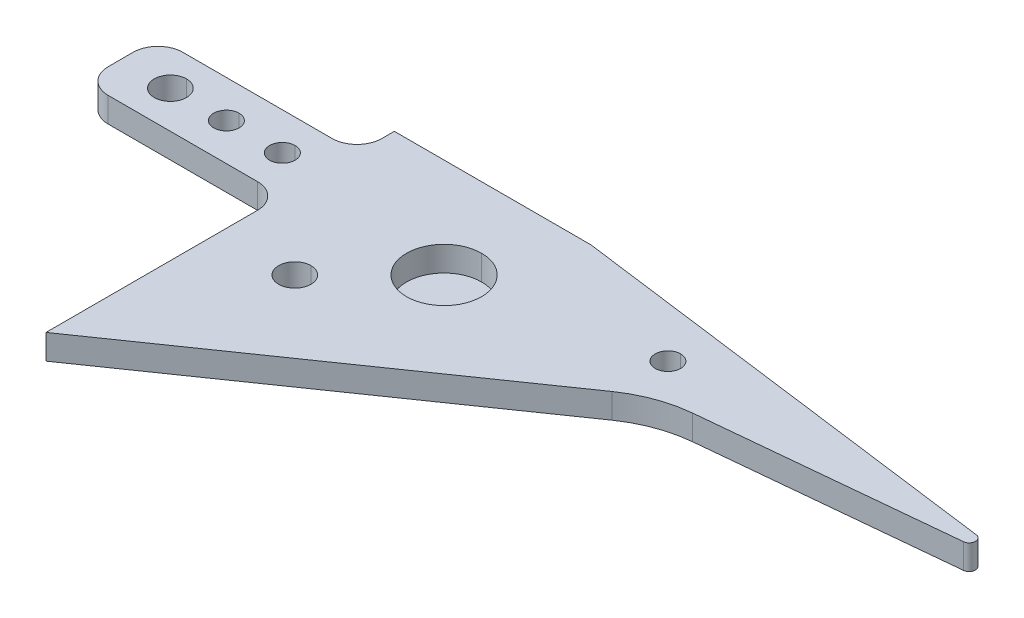
ISO-10303-21;
HEADER;
FILE_DESCRIPTION(('STEP AP214'),'2;1');
FILE_NAME('part.step','',(''),(''),'','','');
FILE_SCHEMA(('AUTOMOTIVE_DESIGN { 1 0 10303 214 1 1 1 1 }'));
ENDSEC;
DATA;
#1=APPLICATION_CONTEXT('core data for automotive mechanical design processes');
#2=APPLICATION_PROTOCOL_DEFINITION('international standard','automotive_design',2000,#1);
#3=PRODUCT_CONTEXT('',#1,'mechanical');
#4=PRODUCT('Part','Part','',(#3));
#5=PRODUCT_RELATED_PRODUCT_CATEGORY('part','',(#4));
#6=PRODUCT_DEFINITION_FORMATION('','',#4);
#7=PRODUCT_DEFINITION_CONTEXT('part definition',#1,'design');
#8=PRODUCT_DEFINITION('design','',#6,#7);
#9=PRODUCT_DEFINITION_SHAPE('','',#8);
#10=(LENGTH_UNIT() NAMED_UNIT(*) SI_UNIT(.MILLI.,.METRE.));
#11=(NAMED_UNIT(*) PLANE_ANGLE_UNIT() SI_UNIT($,.RADIAN.));
#12=(NAMED_UNIT(*) SI_UNIT($,.STERADIAN.) SOLID_ANGLE_UNIT());
#13=UNCERTAINTY_MEASURE_WITH_UNIT(LENGTH_MEASURE(1.E-05),#10,'distance_accuracy_value','');
#14=(GEOMETRIC_REPRESENTATION_CONTEXT(3) GLOBAL_UNCERTAINTY_ASSIGNED_CONTEXT((#13)) GLOBAL_UNIT_ASSIGNED_CONTEXT((#10,
#11,#12)) REPRESENTATION_CONTEXT('',''));
#15=CARTESIAN_POINT('',(0.,0.,0.));
#16=DIRECTION('',(0.,0.,1.));
#17=DIRECTION('',(1.,0.,0.));
#18=AXIS2_PLACEMENT_3D('',#15,#16,#17);
#19=CARTESIAN_POINT('',(43.,-2.,10.));
#20=DIRECTION('',(0.,-1.,0.));
#21=DIRECTION('',(0.,0.,-1.));
#22=AXIS2_PLACEMENT_3D('',#19,#20,#21);
#23=PLANE('',#22);
#24=CARTESIAN_POINT('',(43.,-2.,10.));
#25=DIRECTION('',(0.,-1.,0.));
#26=DIRECTION('',(0.,0.,-1.));
#27=AXIS2_PLACEMENT_3D('',#24,#25,#26);
#28=CIRCLE('',#27,4.02);
#29=CARTESIAN_POINT('',(43.,-2.,14.02));
#30=VERTEX_POINT('',#29);
#31=CARTESIAN_POINT('',(43.,-2.,5.98));
#32=VERTEX_POINT('',#31);
#33=EDGE_CURVE('E10',#30,#32,#28,.T.);
#34=ORIENTED_EDGE('',*,*,#33,.T.);
#35=CARTESIAN_POINT('',(43.,-2.,10.));
#36=DIRECTION('',(0.,-1.,0.));
#37=DIRECTION('',(0.,0.,-1.));
#38=AXIS2_PLACEMENT_3D('',#35,#36,#37);
#39=CIRCLE('',#38,4.02);
#40=EDGE_CURVE('E276',#32,#30,#39,.T.);
#41=ORIENTED_EDGE('',*,*,#40,.T.);
#42=EDGE_LOOP('',(#34,#41));
#43=FACE_BOUND('',#42,.T.);
#44=ADVANCED_FACE('F16',(#43),#23,.T.);
#45=CARTESIAN_POINT('',(43.,-2.,10.));
#46=DIRECTION('',(0.,1.,0.));
#47=DIRECTION('',(0.,0.,1.));
#48=AXIS2_PLACEMENT_3D('',#45,#46,#47);
#49=CYLINDRICAL_SURFACE('',#48,4.02);
#50=DIRECTION('',(0.,1.,0.));
#51=VECTOR('',#50,1.);
#52=CARTESIAN_POINT('',(43.,-2.,5.98));
#53=LINE('',#52,#51);
#54=CARTESIAN_POINT('',(43.,0.,5.98));
#55=VERTEX_POINT('',#54);
#56=EDGE_CURVE('E281',#32,#55,#53,.T.);
#57=ORIENTED_EDGE('',*,*,#56,.F.);
#58=ORIENTED_EDGE('',*,*,#33,.F.);
#59=DIRECTION('',(0.,1.,0.));
#60=VECTOR('',#59,1.);
#61=CARTESIAN_POINT('',(43.,-2.,14.02));
#62=LINE('',#61,#60);
#63=CARTESIAN_POINT('',(43.,0.,14.02));
#64=VERTEX_POINT('',#63);
#65=EDGE_CURVE('E291',#30,#64,#62,.T.);
#66=ORIENTED_EDGE('',*,*,#65,.T.);
#67=CARTESIAN_POINT('',(43.,0.,10.));
#68=DIRECTION('',(0.,-1.,0.));
#69=DIRECTION('',(0.,0.,-1.));
#70=AXIS2_PLACEMENT_3D('',#67,#68,#69);
#71=CIRCLE('',#70,4.02);
#72=EDGE_CURVE('E283',#64,#55,#71,.T.);
#73=ORIENTED_EDGE('',*,*,#72,.T.);
#74=EDGE_LOOP('',(#57,#58,#66,#73));
#75=FACE_BOUND('',#74,.T.);
#76=ADVANCED_FACE('F282',(#75),#49,.T.);
#77=CARTESIAN_POINT('',(43.,0.,10.));
#78=DIRECTION('',(0.,-1.,0.));
#79=DIRECTION('',(0.,0.,-1.));
#80=AXIS2_PLACEMENT_3D('',#77,#78,#79);
#81=PLANE('',#80);
#82=CARTESIAN_POINT('',(43.,0.,10.));
#83=DIRECTION('',(0.,1.,0.));
#84=DIRECTION('',(0.,0.,-1.));
#85=AXIS2_PLACEMENT_3D('',#82,#83,#84);
#86=CIRCLE('',#85,3.02);
#87=CARTESIAN_POINT('',(43.,0.,6.98));
#88=VERTEX_POINT('',#87);
#89=CARTESIAN_POINT('',(43.,0.,13.02));
#90=VERTEX_POINT('',#89);
#91=EDGE_CURVE('E346',#88,#90,#86,.T.);
#92=ORIENTED_EDGE('',*,*,#91,.T.);
#93=CARTESIAN_POINT('',(43.,0.,10.));
#94=DIRECTION('',(0.,1.,0.));
#95=DIRECTION('',(0.,0.,-1.));
#96=AXIS2_PLACEMENT_3D('',#93,#94,#95);
#97=CIRCLE('',#96,3.02);
#98=EDGE_CURVE('E19',#90,#88,#97,.T.);
#99=ORIENTED_EDGE('',*,*,#98,.T.);
#100=EDGE_LOOP('',(#92,#99));
#101=FACE_BOUND('',#100,.T.);
#102=ADVANCED_FACE('F1351',(#101),#81,.F.);
#103=CARTESIAN_POINT('',(43.,2.54,10.));
#104=DIRECTION('',(0.,-1.,0.));
#105=DIRECTION('',(0.,0.,-1.));
#106=AXIS2_PLACEMENT_3D('',#103,#104,#105);
#107=CYLINDRICAL_SURFACE('',#106,3.02);
#108=DIRECTION('',(0.,-1.,0.));
#109=VECTOR('',#108,1.);
#110=CARTESIAN_POINT('',(43.,2.54,13.02));
#111=LINE('',#110,#109);
#112=CARTESIAN_POINT('',(43.,2.,13.02));
#113=VERTEX_POINT('',#112);
#114=EDGE_CURVE('E342',#113,#90,#111,.T.);
#115=ORIENTED_EDGE('',*,*,#114,.F.);
#116=CARTESIAN_POINT('',(43.,2.,10.));
#117=DIRECTION('',(0.,-1.,0.));
#118=DIRECTION('',(0.,0.,-1.));
#119=AXIS2_PLACEMENT_3D('',#116,#117,#118);
#120=CIRCLE('',#119,3.02);
#121=CARTESIAN_POINT('',(43.,2.,6.98));
#122=VERTEX_POINT('',#121);
#123=EDGE_CURVE('E403',#122,#113,#120,.T.);
#124=ORIENTED_EDGE('',*,*,#123,.F.);
#125=DIRECTION('',(0.,-1.,0.));
#126=VECTOR('',#125,1.);
#127=CARTESIAN_POINT('',(43.,2.54,6.98));
#128=LINE('',#127,#126);
#129=EDGE_CURVE('E350',#122,#88,#128,.T.);
#130=ORIENTED_EDGE('',*,*,#129,.T.);
#131=ORIENTED_EDGE('',*,*,#98,.F.);
#132=EDGE_LOOP('',(#115,#124,#130,#131));
#133=FACE_BOUND('',#132,.T.);
#134=ADVANCED_FACE('F1340',(#133),#107,.F.);
#135=CARTESIAN_POINT('',(36.9999999999907,0.,15.9999999999994));
#136=DIRECTION('',(0.,1.,0.));
#137=DIRECTION('',(0.,0.,1.));
#138=AXIS2_PLACEMENT_3D('',#135,#136,#137);
#139=CYLINDRICAL_SURFACE('',#138,1.3);
#140=DIRECTION('',(0.,1.,0.));
#141=VECTOR('',#140,1.);
#142=CARTESIAN_POINT('',(36.9999999999907,0.,14.6999999999994));
#143=LINE('',#142,#141);
#144=CARTESIAN_POINT('',(36.9999999999907,0.,14.6999999999994));
#145=VERTEX_POINT('',#144);
#146=CARTESIAN_POINT('',(36.9999999999907,2.,14.6999999999994));
#147=VERTEX_POINT('',#146);
#148=EDGE_CURVE('E358',#145,#147,#143,.T.);
#149=ORIENTED_EDGE('',*,*,#148,.F.);
#150=CARTESIAN_POINT('',(36.9999999999907,0.,15.9999999999994));
#151=DIRECTION('',(0.,1.,0.));
#152=DIRECTION('',(0.,0.,1.));
#153=AXIS2_PLACEMENT_3D('',#150,#151,#152);
#154=CIRCLE('',#153,1.3);
#155=CARTESIAN_POINT('',(36.9999999999907,0.,17.2999999999994));
#156=VERTEX_POINT('',#155);
#157=EDGE_CURVE('E458',#156,#145,#154,.T.);
#158=ORIENTED_EDGE('',*,*,#157,.F.);
#159=DIRECTION('',(0.,1.,0.));
#160=VECTOR('',#159,1.);
#161=CARTESIAN_POINT('',(36.9999999999907,0.,17.2999999999994));
#162=LINE('',#161,#160);
#163=CARTESIAN_POINT('',(36.9999999999907,2.,17.2999999999994));
#164=VERTEX_POINT('',#163);
#165=EDGE_CURVE('E309',#156,#164,#162,.T.);
#166=ORIENTED_EDGE('',*,*,#165,.T.);
#167=CARTESIAN_POINT('',(36.9999999999907,2.,15.9999999999994));
#168=DIRECTION('',(0.,1.,0.));
#169=DIRECTION('',(0.,0.,1.));
#170=AXIS2_PLACEMENT_3D('',#167,#168,#169);
#171=CIRCLE('',#170,1.3);
#172=EDGE_CURVE('E399',#164,#147,#171,.T.);
#173=ORIENTED_EDGE('',*,*,#172,.T.);
#174=EDGE_LOOP('',(#149,#158,#166,#173));
#175=FACE_BOUND('',#174,.T.);
#176=ADVANCED_FACE('F1329',(#175),#139,.F.);
#177=CARTESIAN_POINT('',(23.5,0.,8.));
#178=DIRECTION('',(0.,-1.,0.));
#179=DIRECTION('',(0.,0.,-1.));
#180=AXIS2_PLACEMENT_3D('',#177,#178,#179);
#181=CYLINDRICAL_SURFACE('',#180,1.025);
#182=DIRECTION('',(0.,-1.,0.));
#183=VECTOR('',#182,1.);
#184=CARTESIAN_POINT('',(23.5,0.,9.025));
#185=LINE('',#184,#183);
#186=CARTESIAN_POINT('',(23.5,2.,9.025));
#187=VERTEX_POINT('',#186);
#188=CARTESIAN_POINT('',(23.5,0.,9.025));
#189=VERTEX_POINT('',#188);
#190=EDGE_CURVE('E301',#187,#189,#185,.T.);
#191=ORIENTED_EDGE('',*,*,#190,.F.);
#192=CARTESIAN_POINT('',(23.5,2.,8.));
#193=DIRECTION('',(0.,-1.,0.));
#194=DIRECTION('',(0.,0.,-1.));
#195=AXIS2_PLACEMENT_3D('',#192,#193,#194);
#196=CIRCLE('',#195,1.025);
#197=CARTESIAN_POINT('',(23.5,2.,6.975));
#198=VERTEX_POINT('',#197);
#199=EDGE_CURVE('E402',#198,#187,#196,.T.);
#200=ORIENTED_EDGE('',*,*,#199,.F.);
#201=DIRECTION('',(0.,-1.,0.));
#202=VECTOR('',#201,1.);
#203=CARTESIAN_POINT('',(23.5,0.,6.975));
#204=LINE('',#203,#202);
#205=CARTESIAN_POINT('',(23.5,0.,6.975));
#206=VERTEX_POINT('',#205);
#207=EDGE_CURVE('E370',#198,#206,#204,.T.);
#208=ORIENTED_EDGE('',*,*,#207,.T.);
#209=CARTESIAN_POINT('',(23.5,0.,8.));
#210=DIRECTION('',(0.,-1.,0.));
#211=DIRECTION('',(0.,0.,-1.));
#212=AXIS2_PLACEMENT_3D('',#209,#210,#211);
#213=CIRCLE('',#212,1.02499999999999);
#214=EDGE_CURVE('E461',#206,#189,#213,.T.);
#215=ORIENTED_EDGE('',*,*,#214,.T.);
#216=EDGE_LOOP('',(#191,#200,#208,#215));
#217=FACE_BOUND('',#216,.T.);
#218=ADVANCED_FACE('F1318',(#217),#181,.F.);
#219=CARTESIAN_POINT('',(19.,10.,8.));
#220=DIRECTION('',(0.,-1.,0.));
#221=DIRECTION('',(0.,0.,-1.));
#222=AXIS2_PLACEMENT_3D('',#219,#220,#221);
#223=CYLINDRICAL_SURFACE('',#222,1.3);
#224=DIRECTION('',(0.,-1.,0.));
#225=VECTOR('',#224,1.);
#226=CARTESIAN_POINT('',(19.,10.,9.3));
#227=LINE('',#226,#225);
#228=CARTESIAN_POINT('',(19.,2.,9.3));
#229=VERTEX_POINT('',#228);
#230=CARTESIAN_POINT('',(19.,0.,9.3));
#231=VERTEX_POINT('',#230);
#232=EDGE_CURVE('E390',#229,#231,#227,.T.);
#233=ORIENTED_EDGE('',*,*,#232,.F.);
#234=CARTESIAN_POINT('',(19.,2.,8.));
#235=DIRECTION('',(0.,-1.,0.));
#236=DIRECTION('',(0.,0.,-1.));
#237=AXIS2_PLACEMENT_3D('',#234,#235,#236);
#238=CIRCLE('',#237,1.3);
#239=CARTESIAN_POINT('',(19.,2.,6.7));
#240=VERTEX_POINT('',#239);
#241=EDGE_CURVE('E513',#240,#229,#238,.T.);
#242=ORIENTED_EDGE('',*,*,#241,.F.);
#243=DIRECTION('',(0.,-1.,0.));
#244=VECTOR('',#243,1.);
#245=CARTESIAN_POINT('',(19.,10.,6.7));
#246=LINE('',#245,#244);
#247=CARTESIAN_POINT('',(19.,0.,6.7));
#248=VERTEX_POINT('',#247);
#249=EDGE_CURVE('E398',#240,#248,#246,.T.);
#250=ORIENTED_EDGE('',*,*,#249,.T.);
#251=CARTESIAN_POINT('',(19.,0.,8.));
#252=DIRECTION('',(0.,-1.,0.));
#253=DIRECTION('',(0.,0.,-1.));
#254=AXIS2_PLACEMENT_3D('',#251,#252,#253);
#255=CIRCLE('',#254,1.3);
#256=EDGE_CURVE('E493',#248,#231,#255,.T.);
#257=ORIENTED_EDGE('',*,*,#256,.T.);
#258=EDGE_LOOP('',(#233,#242,#250,#257));
#259=FACE_BOUND('',#258,.T.);
#260=ADVANCED_FACE('F1307',(#259),#223,.F.);
#261=CARTESIAN_POINT('',(82.4056334382697,2.,7.19216454145172));
#262=DIRECTION('',(0.,1.,0.));
#263=DIRECTION('',(0.,0.,1.));
#264=AXIS2_PLACEMENT_3D('',#261,#262,#263);
#265=CYLINDRICAL_SURFACE('',#264,0.5);
#266=CARTESIAN_POINT('',(82.4056334382697,2.,7.19216454145172));
#267=DIRECTION('',(0.,1.,0.));
#268=DIRECTION('',(0.,0.,-1.));
#269=AXIS2_PLACEMENT_3D('',#266,#267,#268);
#270=CIRCLE('',#269,0.5);
#271=CARTESIAN_POINT('',(82.4541751321196,2.,7.68980266695878));
#272=VERTEX_POINT('',#271);
#273=CARTESIAN_POINT('',(82.4708965343797,2.,6.69644211076482));
#274=VERTEX_POINT('',#273);
#275=EDGE_CURVE('E382',#272,#274,#270,.T.);
#276=ORIENTED_EDGE('',*,*,#275,.F.);
#277=DIRECTION('',(0.,1.,0.));
#278=VECTOR('',#277,1.);
#279=CARTESIAN_POINT('',(82.4541751321196,2.,7.68980266695878));
#280=LINE('',#279,#278);
#281=CARTESIAN_POINT('',(82.4541751321196,0.,7.68980266695878));
#282=VERTEX_POINT('',#281);
#283=EDGE_CURVE('E374',#282,#272,#280,.T.);
#284=ORIENTED_EDGE('',*,*,#283,.F.);
#285=CARTESIAN_POINT('',(82.4056334382697,0.,7.19216454145172));
#286=DIRECTION('',(0.,-1.,0.));
#287=DIRECTION('',(0.,0.,-1.));
#288=AXIS2_PLACEMENT_3D('',#285,#286,#287);
#289=CIRCLE('',#288,0.5);
#290=CARTESIAN_POINT('',(82.4708965343797,0.,6.69644211076482));
#291=VERTEX_POINT('',#290);
#292=EDGE_CURVE('E429',#291,#282,#289,.T.);
#293=ORIENTED_EDGE('',*,*,#292,.F.);
#294=DIRECTION('',(0.,-1.,0.));
#295=VECTOR('',#294,1.);
#296=CARTESIAN_POINT('',(82.4708965343797,0.,6.69644211076482));
#297=LINE('',#296,#295);
#298=EDGE_CURVE('E465',#274,#291,#297,.T.);
#299=ORIENTED_EDGE('',*,*,#298,.F.);
#300=EDGE_LOOP('',(#276,#284,#293,#299));
#301=FACE_BOUND('',#300,.T.);
#302=ADVANCED_FACE('F1037',(#301),#265,.T.);
#303=CARTESIAN_POINT('',(63.5572503408536,31.0427436613577,19.5805490439429));
#304=DIRECTION('',(0.,-1.,0.));
#305=DIRECTION('',(0.,0.,-1.));
#306=AXIS2_PLACEMENT_3D('',#303,#304,#305);
#307=CYLINDRICAL_SURFACE('',#306,10.);
#308=CARTESIAN_POINT('',(63.5572503408536,2.,19.5805490439429));
#309=DIRECTION('',(0.,-1.,0.));
#310=DIRECTION('',(0.,0.,-1.));
#311=AXIS2_PLACEMENT_3D('',#308,#309,#310);
#312=CIRCLE('',#311,10.);
#313=CARTESIAN_POINT('',(57.8563822347313,2.,11.3647044229318));
#314=VERTEX_POINT('',#313);
#315=CARTESIAN_POINT('',(62.5864164638556,2.,9.62778653380169));
#316=VERTEX_POINT('',#315);
#317=EDGE_CURVE('E576',#314,#316,#312,.T.);
#318=ORIENTED_EDGE('',*,*,#317,.F.);
#319=DIRECTION('',(0.,1.,0.));
#320=VECTOR('',#319,1.);
#321=CARTESIAN_POINT('',(57.8563822347313,2.,11.3647044229318));
#322=LINE('',#321,#320);
#323=CARTESIAN_POINT('',(57.8563822347313,0.,11.3647044229318));
#324=VERTEX_POINT('',#323);
#325=EDGE_CURVE('E324',#324,#314,#322,.T.);
#326=ORIENTED_EDGE('',*,*,#325,.F.);
#327=CARTESIAN_POINT('',(63.5572503408536,0.,19.5805490439429));
#328=DIRECTION('',(0.,1.,0.));
#329=DIRECTION('',(0.,0.,-1.));
#330=AXIS2_PLACEMENT_3D('',#327,#328,#329);
#331=CIRCLE('',#330,10.);
#332=CARTESIAN_POINT('',(62.5864164638555,0.,9.62778653380169));
#333=VERTEX_POINT('',#332);
#334=EDGE_CURVE('E362',#333,#324,#331,.T.);
#335=ORIENTED_EDGE('',*,*,#334,.F.);
#336=DIRECTION('',(0.,-1.,0.));
#337=VECTOR('',#336,1.);
#338=CARTESIAN_POINT('',(62.5864164638555,31.0427436613577,9.62778653380169));
#339=LINE('',#338,#337);
#340=EDGE_CURVE('E371',#316,#333,#339,.T.);
#341=ORIENTED_EDGE('',*,*,#340,.F.);
#342=EDGE_LOOP('',(#318,#326,#335,#341));
#343=FACE_BOUND('',#342,.T.);
#344=ADVANCED_FACE('F1031',(#343),#307,.F.);
#345=CARTESIAN_POINT('',(1.52017135493671,31.0427436613577,15.5844422293835));
#346=DIRECTION('',(0.0970833876998064,0.,0.995276251014124));
#347=DIRECTION('',(0.,-1.,0.));
#348=AXIS2_PLACEMENT_3D('',#345,#346,#347);
#349=PLANE('',#348);
#350=DIRECTION('',(-0.995276251014124,0.,0.0970833876998064));
#351=VECTOR('',#350,1.);
#352=CARTESIAN_POINT('',(1.52017135493671,0.,15.5844422293835));
#353=LINE('',#352,#351);
#354=EDGE_CURVE('E366',#282,#333,#353,.T.);
#355=ORIENTED_EDGE('',*,*,#354,.F.);
#356=ORIENTED_EDGE('',*,*,#283,.T.);
#357=DIRECTION('',(0.995276251014124,0.,-0.0970833876998064));
#358=VECTOR('',#357,1.);
#359=CARTESIAN_POINT('',(1.52017135493671,2.,15.5844422293835));
#360=LINE('',#359,#358);
#361=EDGE_CURVE('E549',#316,#272,#360,.T.);
#362=ORIENTED_EDGE('',*,*,#361,.F.);
#363=ORIENTED_EDGE('',*,*,#340,.T.);
#364=EDGE_LOOP('',(#355,#356,#362,#363));
#365=FACE_BOUND('',#364,.T.);
#366=ADVANCED_FACE('F1036',(#365),#349,.T.);
#367=CARTESIAN_POINT('',(28.,2.,8.));
#368=DIRECTION('',(0.,1.,0.));
#369=DIRECTION('',(0.,0.,1.));
#370=AXIS2_PLACEMENT_3D('',#367,#368,#369);
#371=CYLINDRICAL_SURFACE('',#370,1.025);
#372=DIRECTION('',(0.,1.,0.));
#373=VECTOR('',#372,1.);
#374=CARTESIAN_POINT('',(28.,2.,6.975));
#375=LINE('',#374,#373);
#376=CARTESIAN_POINT('',(28.,0.,6.975));
#377=VERTEX_POINT('',#376);
#378=CARTESIAN_POINT('',(28.,2.,6.975));
#379=VERTEX_POINT('',#378);
#380=EDGE_CURVE('E411',#377,#379,#375,.T.);
#381=ORIENTED_EDGE('',*,*,#380,.F.);
#382=CARTESIAN_POINT('',(28.,0.,8.));
#383=DIRECTION('',(0.,1.,0.));
#384=DIRECTION('',(0.,0.,1.));
#385=AXIS2_PLACEMENT_3D('',#382,#383,#384);
#386=CIRCLE('',#385,1.025);
#387=CARTESIAN_POINT('',(28.,0.,9.025));
#388=VERTEX_POINT('',#387);
#389=EDGE_CURVE('E496',#388,#377,#386,.T.);
#390=ORIENTED_EDGE('',*,*,#389,.F.);
#391=DIRECTION('',(0.,1.,0.));
#392=VECTOR('',#391,1.);
#393=CARTESIAN_POINT('',(28.,2.,9.025));
#394=LINE('',#393,#392);
#395=CARTESIAN_POINT('',(28.,2.,9.025));
#396=VERTEX_POINT('',#395);
#397=EDGE_CURVE('E425',#388,#396,#394,.T.);
#398=ORIENTED_EDGE('',*,*,#397,.T.);
#399=CARTESIAN_POINT('',(28.,2.,8.));
#400=DIRECTION('',(0.,1.,0.));
#401=DIRECTION('',(0.,0.,1.));
#402=AXIS2_PLACEMENT_3D('',#399,#400,#401);
#403=CIRCLE('',#402,1.02499999999999);
#404=EDGE_CURVE('E428',#396,#379,#403,.T.);
#405=ORIENTED_EDGE('',*,*,#404,.T.);
#406=EDGE_LOOP('',(#381,#390,#398,#405));
#407=FACE_BOUND('',#406,.T.);
#408=ADVANCED_FACE('F1276',(#407),#371,.F.);
#409=CARTESIAN_POINT('',(29.,1.,3.));
#410=DIRECTION('',(0.,-1.,0.));
#411=DIRECTION('',(0.,0.,-1.));
#412=AXIS2_PLACEMENT_3D('',#409,#410,#411);
#413=CYLINDRICAL_SURFACE('',#412,2.);
#414=CARTESIAN_POINT('',(29.,0.,3.));
#415=DIRECTION('',(0.,1.,0.));
#416=DIRECTION('',(0.,0.,-1.));
#417=AXIS2_PLACEMENT_3D('',#414,#415,#416);
#418=CIRCLE('',#417,2.);
#419=CARTESIAN_POINT('',(29.,0.,5.));
#420=VERTEX_POINT('',#419);
#421=CARTESIAN_POINT('',(31.,0.,3.));
#422=VERTEX_POINT('',#421);
#423=EDGE_CURVE('E497',#420,#422,#418,.T.);
#424=ORIENTED_EDGE('',*,*,#423,.F.);
#425=DIRECTION('',(0.,-1.,0.));
#426=VECTOR('',#425,1.);
#427=CARTESIAN_POINT('',(29.,0.,5.));
#428=LINE('',#427,#426);
#429=CARTESIAN_POINT('',(29.,2.,5.));
#430=VERTEX_POINT('',#429);
#431=EDGE_CURVE('E331',#430,#420,#428,.T.);
#432=ORIENTED_EDGE('',*,*,#431,.F.);
#433=CARTESIAN_POINT('',(29.,2.,3.));
#434=DIRECTION('',(0.,-1.,0.));
#435=DIRECTION('',(0.,0.,-1.));
#436=AXIS2_PLACEMENT_3D('',#433,#434,#435);
#437=CIRCLE('',#436,2.);
#438=CARTESIAN_POINT('',(31.,2.,3.));
#439=VERTEX_POINT('',#438);
#440=EDGE_CURVE('E381',#439,#430,#437,.T.);
#441=ORIENTED_EDGE('',*,*,#440,.F.);
#442=DIRECTION('',(0.,1.,0.));
#443=VECTOR('',#442,1.);
#444=CARTESIAN_POINT('',(31.,2.,3.));
#445=LINE('',#444,#443);
#446=EDGE_CURVE('E485',#422,#439,#445,.T.);
#447=ORIENTED_EDGE('',*,*,#446,.F.);
#448=EDGE_LOOP('',(#424,#432,#441,#447));
#449=FACE_BOUND('',#448,.T.);
#450=ADVANCED_FACE('F1266',(#449),#413,.F.);
#451=CARTESIAN_POINT('',(29.,-17.0880074906351,13.));
#452=DIRECTION('',(0.,-1.,0.));
#453=DIRECTION('',(0.,0.,-1.));
#454=AXIS2_PLACEMENT_3D('',#451,#452,#453);
#455=CYLINDRICAL_SURFACE('',#454,2.);
#456=CARTESIAN_POINT('',(29.,0.,13.));
#457=DIRECTION('',(0.,1.,0.));
#458=DIRECTION('',(0.,0.,-1.));
#459=AXIS2_PLACEMENT_3D('',#456,#457,#458);
#460=CIRCLE('',#459,2.);
#461=CARTESIAN_POINT('',(31.,0.,13.));
#462=VERTEX_POINT('',#461);
#463=CARTESIAN_POINT('',(29.,0.,11.));
#464=VERTEX_POINT('',#463);
#465=EDGE_CURVE('E318',#462,#464,#460,.T.);
#466=ORIENTED_EDGE('',*,*,#465,.F.);
#467=DIRECTION('',(0.,-1.,0.));
#468=VECTOR('',#467,1.);
#469=CARTESIAN_POINT('',(31.,0.,13.));
#470=LINE('',#469,#468);
#471=CARTESIAN_POINT('',(31.,2.,13.));
#472=VERTEX_POINT('',#471);
#473=EDGE_CURVE('E38',#472,#462,#470,.T.);
#474=ORIENTED_EDGE('',*,*,#473,.F.);
#475=CARTESIAN_POINT('',(29.,2.,13.));
#476=DIRECTION('',(0.,-1.,0.));
#477=DIRECTION('',(0.,0.,-1.));
#478=AXIS2_PLACEMENT_3D('',#475,#476,#477);
#479=CIRCLE('',#478,2.);
#480=CARTESIAN_POINT('',(29.,2.,11.));
#481=VERTEX_POINT('',#480);
#482=EDGE_CURVE('E546',#481,#472,#479,.T.);
#483=ORIENTED_EDGE('',*,*,#482,.F.);
#484=DIRECTION('',(0.,1.,0.));
#485=VECTOR('',#484,1.);
#486=CARTESIAN_POINT('',(29.,2.,11.));
#487=LINE('',#486,#485);
#488=EDGE_CURVE('E49',#464,#481,#487,.T.);
#489=ORIENTED_EDGE('',*,*,#488,.F.);
#490=EDGE_LOOP('',(#466,#474,#483,#489));
#491=FACE_BOUND('',#490,.T.);
#492=ADVANCED_FACE('F1255',(#491),#455,.F.);
#493=CARTESIAN_POINT('',(17.,-17.0880074906351,7.));
#494=DIRECTION('',(0.,1.,0.));
#495=DIRECTION('',(0.,0.,1.));
#496=AXIS2_PLACEMENT_3D('',#493,#494,#495);
#497=CYLINDRICAL_SURFACE('',#496,2.);
#498=CARTESIAN_POINT('',(17.,0.,7.));
#499=DIRECTION('',(0.,-1.,0.));
#500=DIRECTION('',(0.,0.,-1.));
#501=AXIS2_PLACEMENT_3D('',#498,#499,#500);
#502=CIRCLE('',#501,2.);
#503=CARTESIAN_POINT('',(15.,0.,7.));
#504=VERTEX_POINT('',#503);
#505=CARTESIAN_POINT('',(17.,0.,5.));
#506=VERTEX_POINT('',#505);
#507=EDGE_CURVE('E534',#504,#506,#502,.T.);
#508=ORIENTED_EDGE('',*,*,#507,.F.);
#509=DIRECTION('',(0.,-1.,0.));
#510=VECTOR('',#509,1.);
#511=CARTESIAN_POINT('',(15.,-17.0880074906351,7.));
#512=LINE('',#511,#510);
#513=CARTESIAN_POINT('',(15.,2.,7.));
#514=VERTEX_POINT('',#513);
#515=EDGE_CURVE('E437',#514,#504,#512,.T.);
#516=ORIENTED_EDGE('',*,*,#515,.F.);
#517=CARTESIAN_POINT('',(17.,2.,7.));
#518=DIRECTION('',(0.,1.,0.));
#519=DIRECTION('',(0.,0.,-1.));
#520=AXIS2_PLACEMENT_3D('',#517,#518,#519);
#521=CIRCLE('',#520,2.);
#522=CARTESIAN_POINT('',(17.,2.,5.));
#523=VERTEX_POINT('',#522);
#524=EDGE_CURVE('E518',#523,#514,#521,.T.);
#525=ORIENTED_EDGE('',*,*,#524,.F.);
#526=DIRECTION('',(0.,1.,0.));
#527=VECTOR('',#526,1.);
#528=CARTESIAN_POINT('',(17.,-17.0880074906351,5.));
#529=LINE('',#528,#527);
#530=EDGE_CURVE('E328',#506,#523,#529,.T.);
#531=ORIENTED_EDGE('',*,*,#530,.F.);
#532=EDGE_LOOP('',(#508,#516,#525,#531));
#533=FACE_BOUND('',#532,.T.);
#534=ADVANCED_FACE('F1244',(#533),#497,.T.);
#535=CARTESIAN_POINT('',(17.,-17.0880074906351,9.));
#536=DIRECTION('',(0.,1.,0.));
#537=DIRECTION('',(0.,0.,1.));
#538=AXIS2_PLACEMENT_3D('',#535,#536,#537);
#539=CYLINDRICAL_SURFACE('',#538,2.);
#540=CARTESIAN_POINT('',(17.,0.,9.));
#541=DIRECTION('',(0.,-1.,0.));
#542=DIRECTION('',(0.,0.,-1.));
#543=AXIS2_PLACEMENT_3D('',#540,#541,#542);
#544=CIRCLE('',#543,2.);
#545=CARTESIAN_POINT('',(17.,0.,11.));
#546=VERTEX_POINT('',#545);
#547=CARTESIAN_POINT('',(15.,0.,9.));
#548=VERTEX_POINT('',#547);
#549=EDGE_CURVE('E317',#546,#548,#544,.T.);
#550=ORIENTED_EDGE('',*,*,#549,.F.);
#551=DIRECTION('',(0.,-1.,0.));
#552=VECTOR('',#551,1.);
#553=CARTESIAN_POINT('',(17.,-17.0880074906351,11.));
#554=LINE('',#553,#552);
#555=CARTESIAN_POINT('',(17.,2.,11.));
#556=VERTEX_POINT('',#555);
#557=EDGE_CURVE('E440',#556,#546,#554,.T.);
#558=ORIENTED_EDGE('',*,*,#557,.F.);
#559=CARTESIAN_POINT('',(17.,2.,9.));
#560=DIRECTION('',(0.,1.,0.));
#561=DIRECTION('',(0.,0.,-1.));
#562=AXIS2_PLACEMENT_3D('',#559,#560,#561);
#563=CIRCLE('',#562,2.);
#564=CARTESIAN_POINT('',(15.,2.,9.));
#565=VERTEX_POINT('',#564);
#566=EDGE_CURVE('E412',#565,#556,#563,.T.);
#567=ORIENTED_EDGE('',*,*,#566,.F.);
#568=DIRECTION('',(0.,1.,0.));
#569=VECTOR('',#568,1.);
#570=CARTESIAN_POINT('',(15.,-17.0880074906351,9.));
#571=LINE('',#570,#569);
#572=EDGE_CURVE('E441',#548,#565,#571,.T.);
#573=ORIENTED_EDGE('',*,*,#572,.F.);
#574=EDGE_LOOP('',(#550,#558,#567,#573));
#575=FACE_BOUND('',#574,.T.);
#576=ADVANCED_FACE('F1234',(#575),#539,.T.);
#577=CARTESIAN_POINT('',(31.,-17.0880074906351,11.));
#578=DIRECTION('',(0.,0.,1.));
#579=DIRECTION('',(1.,0.,0.));
#580=AXIS2_PLACEMENT_3D('',#577,#578,#579);
#581=PLANE('',#580);
#582=DIRECTION('',(1.,0.,0.));
#583=VECTOR('',#582,1.);
#584=CARTESIAN_POINT('',(31.,2.,11.));
#585=LINE('',#584,#583);
#586=EDGE_CURVE('E416',#556,#481,#585,.T.);
#587=ORIENTED_EDGE('',*,*,#586,.F.);
#588=ORIENTED_EDGE('',*,*,#557,.T.);
#589=DIRECTION('',(1.,0.,0.));
#590=VECTOR('',#589,1.);
#591=CARTESIAN_POINT('',(31.,0.,11.));
#592=LINE('',#591,#590);
#593=EDGE_CURVE('E314',#546,#464,#592,.T.);
#594=ORIENTED_EDGE('',*,*,#593,.T.);
#595=ORIENTED_EDGE('',*,*,#488,.T.);
#596=EDGE_LOOP('',(#587,#588,#594,#595));
#597=FACE_BOUND('',#596,.T.);
#598=ADVANCED_FACE('F1223',(#597),#581,.T.);
#599=CARTESIAN_POINT('',(15.,-17.0880074906351,5.));
#600=DIRECTION('',(-1.,0.,0.));
#601=DIRECTION('',(0.,0.,1.));
#602=AXIS2_PLACEMENT_3D('',#599,#600,#601);
#603=PLANE('',#602);
#604=DIRECTION('',(0.,0.,1.));
#605=VECTOR('',#604,1.);
#606=CARTESIAN_POINT('',(15.,0.,5.));
#607=LINE('',#606,#605);
#608=EDGE_CURVE('E530',#504,#548,#607,.T.);
#609=ORIENTED_EDGE('',*,*,#608,.T.);
#610=ORIENTED_EDGE('',*,*,#572,.T.);
#611=DIRECTION('',(0.,0.,1.));
#612=VECTOR('',#611,1.);
#613=CARTESIAN_POINT('',(15.,2.,5.));
#614=LINE('',#613,#612);
#615=EDGE_CURVE('E417',#514,#565,#614,.T.);
#616=ORIENTED_EDGE('',*,*,#615,.F.);
#617=ORIENTED_EDGE('',*,*,#515,.T.);
#618=EDGE_LOOP('',(#609,#610,#616,#617));
#619=FACE_BOUND('',#618,.T.);
#620=ADVANCED_FACE('F1162',(#619),#603,.T.);
#621=CARTESIAN_POINT('',(31.,-17.0880074906351,5.));
#622=DIRECTION('',(0.,0.,-1.));
#623=DIRECTION('',(-1.,0.,0.));
#624=AXIS2_PLACEMENT_3D('',#621,#622,#623);
#625=PLANE('',#624);
#626=DIRECTION('',(-1.,0.,0.));
#627=VECTOR('',#626,1.);
#628=CARTESIAN_POINT('',(31.,0.,5.));
#629=LINE('',#628,#627);
#630=EDGE_CURVE('E501',#420,#506,#629,.T.);
#631=ORIENTED_EDGE('',*,*,#630,.T.);
#632=ORIENTED_EDGE('',*,*,#530,.T.);
#633=DIRECTION('',(-1.,0.,0.));
#634=VECTOR('',#633,1.);
#635=CARTESIAN_POINT('',(31.,2.,5.));
#636=LINE('',#635,#634);
#637=EDGE_CURVE('E514',#430,#523,#636,.T.);
#638=ORIENTED_EDGE('',*,*,#637,.F.);
#639=ORIENTED_EDGE('',*,*,#431,.T.);
#640=EDGE_LOOP('',(#631,#632,#638,#639));
#641=FACE_BOUND('',#640,.T.);
#642=ADVANCED_FACE('F1158',(#641),#625,.T.);
#643=CARTESIAN_POINT('',(0.,2.,2.));
#644=DIRECTION('',(0.,0.,1.));
#645=DIRECTION('',(1.,0.,0.));
#646=AXIS2_PLACEMENT_3D('',#643,#644,#645);
#647=PLANE('',#646);
#648=DIRECTION('',(-1.,0.,0.));
#649=VECTOR('',#648,1.);
#650=CARTESIAN_POINT('',(58.,0.,2.));
#651=LINE('',#650,#649);
#652=CARTESIAN_POINT('',(46.7978770563625,0.,2.));
#653=VERTEX_POINT('',#652);
#654=CARTESIAN_POINT('',(31.,0.,2.));
#655=VERTEX_POINT('',#654);
#656=EDGE_CURVE('E500',#653,#655,#651,.T.);
#657=ORIENTED_EDGE('',*,*,#656,.T.);
#658=DIRECTION('',(0.,1.,0.));
#659=VECTOR('',#658,1.);
#660=CARTESIAN_POINT('',(31.,2.,2.));
#661=LINE('',#660,#659);
#662=CARTESIAN_POINT('',(31.,2.,2.));
#663=VERTEX_POINT('',#662);
#664=EDGE_CURVE('E298',#655,#663,#661,.T.);
#665=ORIENTED_EDGE('',*,*,#664,.T.);
#666=DIRECTION('',(-1.,0.,0.));
#667=VECTOR('',#666,1.);
#668=CARTESIAN_POINT('',(0.,2.,2.));
#669=LINE('',#668,#667);
#670=CARTESIAN_POINT('',(46.7978770563625,2.,2.));
#671=VERTEX_POINT('',#670);
#672=EDGE_CURVE('E378',#671,#663,#669,.T.);
#673=ORIENTED_EDGE('',*,*,#672,.F.);
#674=DIRECTION('',(0.,1.,0.));
#675=VECTOR('',#674,1.);
#676=CARTESIAN_POINT('',(46.7978770563626,2.,2.));
#677=LINE('',#676,#675);
#678=EDGE_CURVE('E473',#653,#671,#677,.T.);
#679=ORIENTED_EDGE('',*,*,#678,.F.);
#680=EDGE_LOOP('',(#657,#665,#673,#679));
#681=FACE_BOUND('',#680,.T.);
#682=ADVANCED_FACE('F1129',(#681),#647,.F.);
#683=CARTESIAN_POINT('',(58.,4.88499566724111,7.00498882584149));
#684=DIRECTION('',(0.,-1.,0.));
#685=DIRECTION('',(0.,0.,-1.));
#686=AXIS2_PLACEMENT_3D('',#683,#684,#685);
#687=CYLINDRICAL_SURFACE('',#686,1.02);
#688=DIRECTION('',(0.,-1.,0.));
#689=VECTOR('',#688,1.);
#690=CARTESIAN_POINT('',(58.,4.88499566724111,8.02498882584149));
#691=LINE('',#690,#689);
#692=CARTESIAN_POINT('',(58.,2.,8.02498882584149));
#693=VERTEX_POINT('',#692);
#694=CARTESIAN_POINT('',(58.,0.,8.02498882584149));
#695=VERTEX_POINT('',#694);
#696=EDGE_CURVE('E445',#693,#695,#691,.T.);
#697=ORIENTED_EDGE('',*,*,#696,.F.);
#698=CARTESIAN_POINT('',(58.,2.,7.00498882584149));
#699=DIRECTION('',(0.,1.,0.));
#700=DIRECTION('',(0.,0.,-1.));
#701=AXIS2_PLACEMENT_3D('',#698,#699,#700);
#702=CIRCLE('',#701,1.02);
#703=CARTESIAN_POINT('',(58.,2.,5.98498882584149));
#704=VERTEX_POINT('',#703);
#705=EDGE_CURVE('E349',#693,#704,#702,.T.);
#706=ORIENTED_EDGE('',*,*,#705,.T.);
#707=DIRECTION('',(0.,-1.,0.));
#708=VECTOR('',#707,1.);
#709=CARTESIAN_POINT('',(58.,4.88499566724111,5.98498882584149));
#710=LINE('',#709,#708);
#711=CARTESIAN_POINT('',(58.,0.,5.98498882584149));
#712=VERTEX_POINT('',#711);
#713=EDGE_CURVE('E453',#704,#712,#710,.T.);
#714=ORIENTED_EDGE('',*,*,#713,.T.);
#715=CARTESIAN_POINT('',(58.,0.,7.00498882584149));
#716=DIRECTION('',(0.,-1.,0.));
#717=DIRECTION('',(0.,0.,-1.));
#718=AXIS2_PLACEMENT_3D('',#715,#716,#717);
#719=CIRCLE('',#718,1.02);
#720=EDGE_CURVE('E556',#712,#695,#719,.T.);
#721=ORIENTED_EDGE('',*,*,#720,.T.);
#722=EDGE_LOOP('',(#697,#706,#714,#721));
#723=FACE_BOUND('',#722,.T.);
#724=ADVANCED_FACE('F1125',(#723),#687,.F.);
#725=CARTESIAN_POINT('',(31.,1.,34.));
#726=DIRECTION('',(-1.,0.,0.));
#727=DIRECTION('',(0.,1.,0.));
#728=AXIS2_PLACEMENT_3D('',#725,#726,#727);
#729=PLANE('',#728);
#730=DIRECTION('',(0.,-1.,0.));
#731=VECTOR('',#730,1.);
#732=CARTESIAN_POINT('',(31.,2.,30.));
#733=LINE('',#732,#731);
#734=CARTESIAN_POINT('',(31.,2.,30.));
#735=VERTEX_POINT('',#734);
#736=CARTESIAN_POINT('',(31.,0.,30.));
#737=VERTEX_POINT('',#736);
#738=EDGE_CURVE('E323',#735,#737,#733,.T.);
#739=ORIENTED_EDGE('',*,*,#738,.F.);
#740=DIRECTION('',(0.,0.,1.));
#741=VECTOR('',#740,1.);
#742=CARTESIAN_POINT('',(31.,2.,34.));
#743=LINE('',#742,#741);
#744=EDGE_CURVE('E573',#472,#735,#743,.T.);
#745=ORIENTED_EDGE('',*,*,#744,.F.);
#746=ORIENTED_EDGE('',*,*,#473,.T.);
#747=DIRECTION('',(0.,0.,1.));
#748=VECTOR('',#747,1.);
#749=CARTESIAN_POINT('',(31.,0.,-30.));
#750=LINE('',#749,#748);
#751=EDGE_CURVE('E365',#462,#737,#750,.T.);
#752=ORIENTED_EDGE('',*,*,#751,.T.);
#753=EDGE_LOOP('',(#739,#745,#746,#752));
#754=FACE_BOUND('',#753,.T.);
#755=ADVANCED_FACE('F1071',(#754),#729,.T.);
#756=CARTESIAN_POINT('',(58.,2.,7.00498882584149));
#757=DIRECTION('',(0.,-1.,0.));
#758=DIRECTION('',(0.,0.,-1.));
#759=AXIS2_PLACEMENT_3D('',#756,#757,#758);
#760=PLANE('',#759);
#761=CARTESIAN_POINT('',(58.,2.,7.00498882584149));
#762=DIRECTION('',(0.,1.,0.));
#763=DIRECTION('',(0.,0.,-1.));
#764=AXIS2_PLACEMENT_3D('',#761,#762,#763);
#765=CIRCLE('',#764,1.02);
#766=EDGE_CURVE('E436',#704,#693,#765,.T.);
#767=ORIENTED_EDGE('',*,*,#766,.F.);
#768=ORIENTED_EDGE('',*,*,#705,.F.);
#769=EDGE_LOOP('',(#767,#768));
#770=FACE_BOUND('',#769,.T.);
#771=ORIENTED_EDGE('',*,*,#404,.F.);
#772=CARTESIAN_POINT('',(28.,2.,8.));
#773=DIRECTION('',(0.,1.,0.));
#774=DIRECTION('',(0.,0.,1.));
#775=AXIS2_PLACEMENT_3D('',#772,#773,#774);
#776=CIRCLE('',#775,1.02499999999999);
#777=EDGE_CURVE('E421',#379,#396,#776,.T.);
#778=ORIENTED_EDGE('',*,*,#777,.F.);
#779=EDGE_LOOP('',(#771,#778));
#780=FACE_BOUND('',#779,.T.);
#781=ORIENTED_EDGE('',*,*,#241,.T.);
#782=CARTESIAN_POINT('',(19.,2.,8.));
#783=DIRECTION('',(0.,-1.,0.));
#784=DIRECTION('',(0.,0.,-1.));
#785=AXIS2_PLACEMENT_3D('',#782,#783,#784);
#786=CIRCLE('',#785,1.3);
#787=EDGE_CURVE('E386',#229,#240,#786,.T.);
#788=ORIENTED_EDGE('',*,*,#787,.T.);
#789=EDGE_LOOP('',(#781,#788));
#790=FACE_BOUND('',#789,.T.);
#791=ORIENTED_EDGE('',*,*,#199,.T.);
#792=CARTESIAN_POINT('',(23.5,2.,8.));
#793=DIRECTION('',(0.,-1.,0.));
#794=DIRECTION('',(0.,0.,-1.));
#795=AXIS2_PLACEMENT_3D('',#792,#793,#794);
#796=CIRCLE('',#795,1.025);
#797=EDGE_CURVE('E306',#187,#198,#796,.T.);
#798=ORIENTED_EDGE('',*,*,#797,.T.);
#799=EDGE_LOOP('',(#791,#798));
#800=FACE_BOUND('',#799,.T.);
#801=ORIENTED_EDGE('',*,*,#172,.F.);
#802=CARTESIAN_POINT('',(36.9999999999907,2.,15.9999999999994));
#803=DIRECTION('',(0.,1.,0.));
#804=DIRECTION('',(0.,0.,1.));
#805=AXIS2_PLACEMENT_3D('',#802,#803,#804);
#806=CIRCLE('',#805,1.3);
#807=EDGE_CURVE('E313',#147,#164,#806,.T.);
#808=ORIENTED_EDGE('',*,*,#807,.F.);
#809=EDGE_LOOP('',(#801,#808));
#810=FACE_BOUND('',#809,.T.);
#811=ORIENTED_EDGE('',*,*,#123,.T.);
#812=CARTESIAN_POINT('',(43.,2.,10.));
#813=DIRECTION('',(0.,-1.,0.));
#814=DIRECTION('',(0.,0.,-1.));
#815=AXIS2_PLACEMENT_3D('',#812,#813,#814);
#816=CIRCLE('',#815,3.02);
#817=EDGE_CURVE('E334',#113,#122,#816,.T.);
#818=ORIENTED_EDGE('',*,*,#817,.T.);
#819=EDGE_LOOP('',(#811,#818));
#820=FACE_BOUND('',#819,.T.);
#821=ORIENTED_EDGE('',*,*,#361,.T.);
#822=ORIENTED_EDGE('',*,*,#275,.T.);
#823=DIRECTION('',(-0.99144486137381,0.,-0.130526192220053));
#824=VECTOR('',#823,1.);
#825=CARTESIAN_POINT('',(43.,2.,1.5));
#826=LINE('',#825,#824);
#827=EDGE_CURVE('E457',#274,#671,#826,.T.);
#828=ORIENTED_EDGE('',*,*,#827,.T.);
#829=ORIENTED_EDGE('',*,*,#672,.T.);
#830=DIRECTION('',(0.,0.,1.));
#831=VECTOR('',#830,1.);
#832=CARTESIAN_POINT('',(31.,2.,34.));
#833=LINE('',#832,#831);
#834=EDGE_CURVE('E489',#663,#439,#833,.T.);
#835=ORIENTED_EDGE('',*,*,#834,.T.);
#836=ORIENTED_EDGE('',*,*,#440,.T.);
#837=ORIENTED_EDGE('',*,*,#637,.T.);
#838=ORIENTED_EDGE('',*,*,#524,.T.);
#839=ORIENTED_EDGE('',*,*,#615,.T.);
#840=ORIENTED_EDGE('',*,*,#566,.T.);
#841=ORIENTED_EDGE('',*,*,#586,.T.);
#842=ORIENTED_EDGE('',*,*,#482,.T.);
#843=ORIENTED_EDGE('',*,*,#744,.T.);
#844=DIRECTION('',(0.821584462101115,0.,-0.570086810612228));
#845=VECTOR('',#844,1.);
#846=CARTESIAN_POINT('',(59.9953038371428,2.,9.88053444319538));
#847=LINE('',#846,#845);
#848=EDGE_CURVE('E319',#735,#314,#847,.T.);
#849=ORIENTED_EDGE('',*,*,#848,.T.);
#850=ORIENTED_EDGE('',*,*,#317,.T.);
#851=EDGE_LOOP('',(#821,#822,#828,#829,#835,#836,#837,#838,#839,#840,#841,#842,#843,#849,#850));
#852=FACE_BOUND('',#851,.T.);
#853=ADVANCED_FACE('F1066',(#770,#780,#790,#800,#810,#820,#852),#760,.F.);
#854=CARTESIAN_POINT('',(58.,0.,7.00498882584149));
#855=DIRECTION('',(0.,-1.,0.));
#856=DIRECTION('',(0.,0.,-1.));
#857=AXIS2_PLACEMENT_3D('',#854,#855,#856);
#858=PLANE('',#857);
#859=ORIENTED_EDGE('',*,*,#720,.F.);
#860=CARTESIAN_POINT('',(58.,0.,7.00498882584149));
#861=DIRECTION('',(0.,-1.,0.));
#862=DIRECTION('',(0.,0.,-1.));
#863=AXIS2_PLACEMENT_3D('',#860,#861,#862);
#864=CIRCLE('',#863,1.02);
#865=EDGE_CURVE('E449',#695,#712,#864,.T.);
#866=ORIENTED_EDGE('',*,*,#865,.F.);
#867=EDGE_LOOP('',(#859,#866));
#868=FACE_BOUND('',#867,.T.);
#869=ORIENTED_EDGE('',*,*,#389,.T.);
#870=CARTESIAN_POINT('',(28.,0.,8.));
#871=DIRECTION('',(0.,1.,0.));
#872=DIRECTION('',(0.,0.,1.));
#873=AXIS2_PLACEMENT_3D('',#870,#871,#872);
#874=CIRCLE('',#873,1.025);
#875=EDGE_CURVE('E407',#377,#388,#874,.T.);
#876=ORIENTED_EDGE('',*,*,#875,.T.);
#877=EDGE_LOOP('',(#869,#876));
#878=FACE_BOUND('',#877,.T.);
#879=ORIENTED_EDGE('',*,*,#256,.F.);
#880=CARTESIAN_POINT('',(19.,0.,8.));
#881=DIRECTION('',(0.,-1.,0.));
#882=DIRECTION('',(0.,0.,-1.));
#883=AXIS2_PLACEMENT_3D('',#880,#881,#882);
#884=CIRCLE('',#883,1.3);
#885=EDGE_CURVE('E394',#231,#248,#884,.T.);
#886=ORIENTED_EDGE('',*,*,#885,.F.);
#887=EDGE_LOOP('',(#879,#886));
#888=FACE_BOUND('',#887,.T.);
#889=ORIENTED_EDGE('',*,*,#214,.F.);
#890=CARTESIAN_POINT('',(23.5,0.,8.));
#891=DIRECTION('',(0.,-1.,0.));
#892=DIRECTION('',(0.,0.,-1.));
#893=AXIS2_PLACEMENT_3D('',#890,#891,#892);
#894=CIRCLE('',#893,1.02499999999999);
#895=EDGE_CURVE('E305',#189,#206,#894,.T.);
#896=ORIENTED_EDGE('',*,*,#895,.F.);
#897=EDGE_LOOP('',(#889,#896));
#898=FACE_BOUND('',#897,.T.);
#899=ORIENTED_EDGE('',*,*,#157,.T.);
#900=CARTESIAN_POINT('',(36.9999999999907,0.,15.9999999999994));
#901=DIRECTION('',(0.,1.,0.));
#902=DIRECTION('',(0.,0.,1.));
#903=AXIS2_PLACEMENT_3D('',#900,#901,#902);
#904=CIRCLE('',#903,1.3);
#905=EDGE_CURVE('E354',#145,#156,#904,.T.);
#906=ORIENTED_EDGE('',*,*,#905,.T.);
#907=EDGE_LOOP('',(#899,#906));
#908=FACE_BOUND('',#907,.T.);
#909=ORIENTED_EDGE('',*,*,#72,.F.);
#910=CARTESIAN_POINT('',(43.,0.,10.));
#911=DIRECTION('',(0.,-1.,0.));
#912=DIRECTION('',(0.,0.,-1.));
#913=AXIS2_PLACEMENT_3D('',#910,#911,#912);
#914=CIRCLE('',#913,4.02);
#915=EDGE_CURVE('E288',#55,#64,#914,.T.);
#916=ORIENTED_EDGE('',*,*,#915,.F.);
#917=EDGE_LOOP('',(#909,#916));
#918=FACE_BOUND('',#917,.T.);
#919=DIRECTION('',(-0.99144486137381,0.,-0.130526192220053));
#920=VECTOR('',#919,1.);
#921=CARTESIAN_POINT('',(43.,0.,1.5));
#922=LINE('',#921,#920);
#923=EDGE_CURVE('E469',#291,#653,#922,.T.);
#924=ORIENTED_EDGE('',*,*,#923,.F.);
#925=ORIENTED_EDGE('',*,*,#292,.T.);
#926=ORIENTED_EDGE('',*,*,#354,.T.);
#927=ORIENTED_EDGE('',*,*,#334,.T.);
#928=DIRECTION('',(0.821584462101115,0.,-0.570086810612228));
#929=VECTOR('',#928,1.);
#930=CARTESIAN_POINT('',(59.9953038371428,0.,9.88053444319539));
#931=LINE('',#930,#929);
#932=EDGE_CURVE('E335',#737,#324,#931,.T.);
#933=ORIENTED_EDGE('',*,*,#932,.F.);
#934=ORIENTED_EDGE('',*,*,#751,.F.);
#935=ORIENTED_EDGE('',*,*,#465,.T.);
#936=ORIENTED_EDGE('',*,*,#593,.F.);
#937=ORIENTED_EDGE('',*,*,#549,.T.);
#938=ORIENTED_EDGE('',*,*,#608,.F.);
#939=ORIENTED_EDGE('',*,*,#507,.T.);
#940=ORIENTED_EDGE('',*,*,#630,.F.);
#941=ORIENTED_EDGE('',*,*,#423,.T.);
#942=DIRECTION('',(0.,0.,1.));
#943=VECTOR('',#942,1.);
#944=CARTESIAN_POINT('',(31.,0.,-30.));
#945=LINE('',#944,#943);
#946=EDGE_CURVE('E481',#655,#422,#945,.T.);
#947=ORIENTED_EDGE('',*,*,#946,.F.);
#948=ORIENTED_EDGE('',*,*,#656,.F.);
#949=EDGE_LOOP('',(#924,#925,#926,#927,#933,#934,#935,#936,#937,#938,#939,#940,#941,#947,#948));
#950=FACE_BOUND('',#949,.T.);
#951=ADVANCED_FACE('F1070',(#868,#878,#888,#898,#908,#918,#950),#858,.T.);
#952=CARTESIAN_POINT('',(59.9953038371428,2.,9.88053444319539));
#953=DIRECTION('',(-0.570086810612228,0.,-0.821584462101115));
#954=DIRECTION('',(-0.821584462101115,0.,0.570086810612228));
#955=AXIS2_PLACEMENT_3D('',#952,#953,#954);
#956=PLANE('',#955);
#957=ORIENTED_EDGE('',*,*,#932,.T.);
#958=ORIENTED_EDGE('',*,*,#325,.T.);
#959=ORIENTED_EDGE('',*,*,#848,.F.);
#960=ORIENTED_EDGE('',*,*,#738,.T.);
#961=EDGE_LOOP('',(#957,#958,#959,#960));
#962=FACE_BOUND('',#961,.T.);
#963=ADVANCED_FACE('F1106',(#962),#956,.F.);
#964=CARTESIAN_POINT('',(31.,1.,34.));
#965=DIRECTION('',(-1.,0.,0.));
#966=DIRECTION('',(0.,1.,0.));
#967=AXIS2_PLACEMENT_3D('',#964,#965,#966);
#968=PLANE('',#967);
#969=ORIENTED_EDGE('',*,*,#946,.T.);
#970=ORIENTED_EDGE('',*,*,#446,.T.);
#971=ORIENTED_EDGE('',*,*,#834,.F.);
#972=ORIENTED_EDGE('',*,*,#664,.F.);
#973=EDGE_LOOP('',(#969,#970,#971,#972));
#974=FACE_BOUND('',#973,.T.);
#975=ADVANCED_FACE('F1101',(#974),#968,.T.);
#976=CARTESIAN_POINT('',(43.,2.,1.5));
#977=DIRECTION('',(-0.130526192220053,0.,0.99144486137381));
#978=DIRECTION('',(0.,1.,0.));
#979=AXIS2_PLACEMENT_3D('',#976,#977,#978);
#980=PLANE('',#979);
#981=ORIENTED_EDGE('',*,*,#827,.F.);
#982=ORIENTED_EDGE('',*,*,#298,.T.);
#983=ORIENTED_EDGE('',*,*,#923,.T.);
#984=ORIENTED_EDGE('',*,*,#678,.T.);
#985=EDGE_LOOP('',(#981,#982,#983,#984));
#986=FACE_BOUND('',#985,.T.);
#987=ADVANCED_FACE('F1105',(#986),#980,.F.);
#988=CARTESIAN_POINT('',(58.,4.88499566724111,7.00498882584149));
#989=DIRECTION('',(0.,-1.,0.));
#990=DIRECTION('',(0.,0.,-1.));
#991=AXIS2_PLACEMENT_3D('',#988,#989,#990);
#992=CYLINDRICAL_SURFACE('',#991,1.02);
#993=ORIENTED_EDGE('',*,*,#766,.T.);
#994=ORIENTED_EDGE('',*,*,#696,.T.);
#995=ORIENTED_EDGE('',*,*,#865,.T.);
#996=ORIENTED_EDGE('',*,*,#713,.F.);
#997=EDGE_LOOP('',(#993,#994,#995,#996));
#998=FACE_BOUND('',#997,.T.);
#999=ADVANCED_FACE('F1140',(#998),#992,.F.);
#1000=CARTESIAN_POINT('',(28.,2.,8.));
#1001=DIRECTION('',(0.,1.,0.));
#1002=DIRECTION('',(0.,0.,1.));
#1003=AXIS2_PLACEMENT_3D('',#1000,#1001,#1002);
#1004=CYLINDRICAL_SURFACE('',#1003,1.025);
#1005=ORIENTED_EDGE('',*,*,#875,.F.);
#1006=ORIENTED_EDGE('',*,*,#380,.T.);
#1007=ORIENTED_EDGE('',*,*,#777,.T.);
#1008=ORIENTED_EDGE('',*,*,#397,.F.);
#1009=EDGE_LOOP('',(#1005,#1006,#1007,#1008));
#1010=FACE_BOUND('',#1009,.T.);
#1011=ADVANCED_FACE('F1117',(#1010),#1004,.F.);
#1012=CARTESIAN_POINT('',(19.,10.,8.));
#1013=DIRECTION('',(0.,-1.,0.));
#1014=DIRECTION('',(0.,0.,-1.));
#1015=AXIS2_PLACEMENT_3D('',#1012,#1013,#1014);
#1016=CYLINDRICAL_SURFACE('',#1015,1.3);
#1017=ORIENTED_EDGE('',*,*,#787,.F.);
#1018=ORIENTED_EDGE('',*,*,#232,.T.);
#1019=ORIENTED_EDGE('',*,*,#885,.T.);
#1020=ORIENTED_EDGE('',*,*,#249,.F.);
#1021=EDGE_LOOP('',(#1017,#1018,#1019,#1020));
#1022=FACE_BOUND('',#1021,.T.);
#1023=ADVANCED_FACE('F1093',(#1022),#1016,.F.);
#1024=CARTESIAN_POINT('',(23.5,0.,8.));
#1025=DIRECTION('',(0.,-1.,0.));
#1026=DIRECTION('',(0.,0.,-1.));
#1027=AXIS2_PLACEMENT_3D('',#1024,#1025,#1026);
#1028=CYLINDRICAL_SURFACE('',#1027,1.025);
#1029=ORIENTED_EDGE('',*,*,#797,.F.);
#1030=ORIENTED_EDGE('',*,*,#190,.T.);
#1031=ORIENTED_EDGE('',*,*,#895,.T.);
#1032=ORIENTED_EDGE('',*,*,#207,.F.);
#1033=EDGE_LOOP('',(#1029,#1030,#1031,#1032));
#1034=FACE_BOUND('',#1033,.T.);
#1035=ADVANCED_FACE('F1082',(#1034),#1028,.F.);
#1036=CARTESIAN_POINT('',(36.9999999999907,0.,15.9999999999994));
#1037=DIRECTION('',(0.,1.,0.));
#1038=DIRECTION('',(0.,0.,1.));
#1039=AXIS2_PLACEMENT_3D('',#1036,#1037,#1038);
#1040=CYLINDRICAL_SURFACE('',#1039,1.3);
#1041=ORIENTED_EDGE('',*,*,#905,.F.);
#1042=ORIENTED_EDGE('',*,*,#148,.T.);
#1043=ORIENTED_EDGE('',*,*,#807,.T.);
#1044=ORIENTED_EDGE('',*,*,#165,.F.);
#1045=EDGE_LOOP('',(#1041,#1042,#1043,#1044));
#1046=FACE_BOUND('',#1045,.T.);
#1047=ADVANCED_FACE('F1058',(#1046),#1040,.F.);
#1048=CARTESIAN_POINT('',(43.,2.54,10.));
#1049=DIRECTION('',(0.,-1.,0.));
#1050=DIRECTION('',(0.,0.,-1.));
#1051=AXIS2_PLACEMENT_3D('',#1048,#1049,#1050);
#1052=CYLINDRICAL_SURFACE('',#1051,3.02);
#1053=ORIENTED_EDGE('',*,*,#817,.F.);
#1054=ORIENTED_EDGE('',*,*,#114,.T.);
#1055=ORIENTED_EDGE('',*,*,#91,.F.);
#1056=ORIENTED_EDGE('',*,*,#129,.F.);
#1057=EDGE_LOOP('',(#1053,#1054,#1055,#1056));
#1058=FACE_BOUND('',#1057,.T.);
#1059=ADVANCED_FACE('F1048',(#1058),#1052,.F.);
#1060=CARTESIAN_POINT('',(43.,-2.,10.));
#1061=DIRECTION('',(0.,1.,0.));
#1062=DIRECTION('',(0.,0.,1.));
#1063=AXIS2_PLACEMENT_3D('',#1060,#1061,#1062);
#1064=CYLINDRICAL_SURFACE('',#1063,4.02);
#1065=ORIENTED_EDGE('',*,*,#40,.F.);
#1066=ORIENTED_EDGE('',*,*,#56,.T.);
#1067=ORIENTED_EDGE('',*,*,#915,.T.);
#1068=ORIENTED_EDGE('',*,*,#65,.F.);
#1069=EDGE_LOOP('',(#1065,#1066,#1067,#1068));
#1070=FACE_BOUND('',#1069,.T.);
#1071=ADVANCED_FACE('F290',(#1070),#1064,.T.);
#1072=CLOSED_SHELL('',(#44,#76,#102,#134,#176,#218,#260,#302,#344,#366,#408,#450,#492,#534,#576,
#598,#620,#642,#682,#724,#755,#853,#951,#963,#975,#987,#999,#1011,#1023,#1035,#1047,#1059,#1071));
#1073=MANIFOLD_SOLID_BREP('B1',#1072);
#1074=ADVANCED_BREP_SHAPE_REPRESENTATION('',(#18,#1073),#14);
#1075=SHAPE_DEFINITION_REPRESENTATION(#9,#1074);
ENDSEC;
END-ISO-10303-21;
